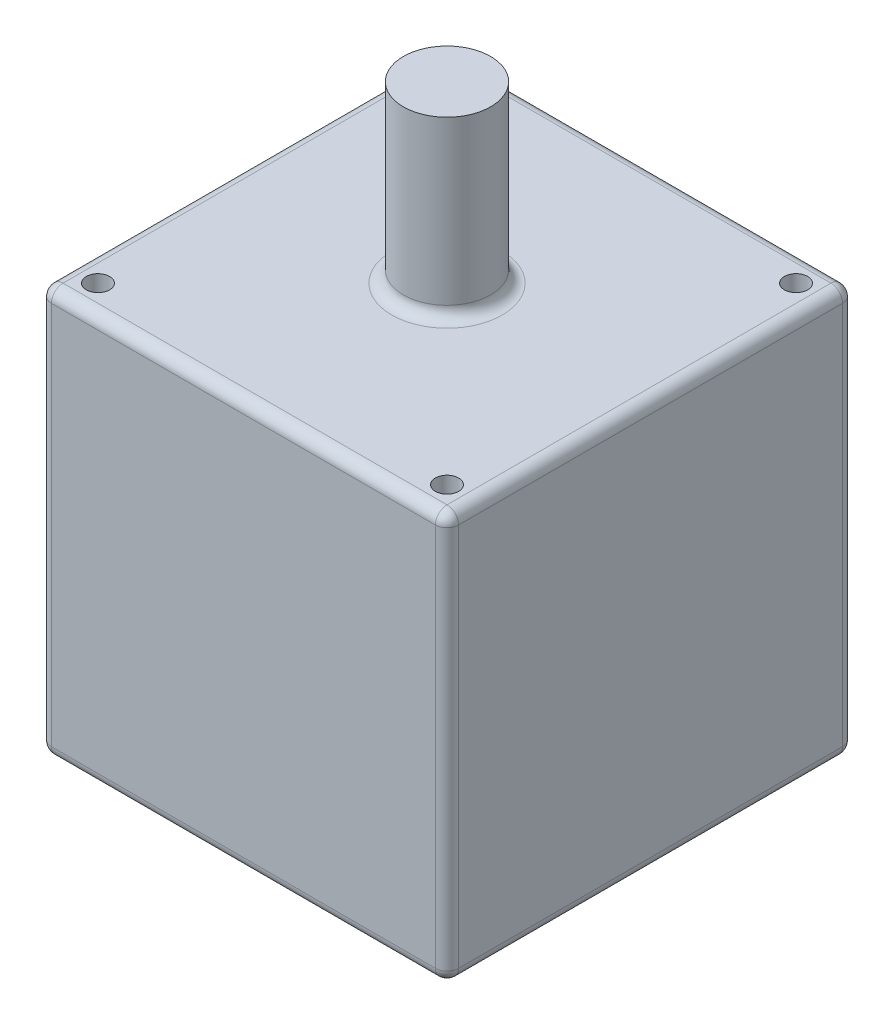
ISO-10303-21;
HEADER;
FILE_DESCRIPTION(('STEP AP214'),'2;1');
FILE_NAME('part.step','',(''),(''),'','','');
FILE_SCHEMA(('AUTOMOTIVE_DESIGN { 1 0 10303 214 1 1 1 1 }'));
ENDSEC;
DATA;
#1=APPLICATION_CONTEXT('core data for automotive mechanical design processes');
#2=APPLICATION_PROTOCOL_DEFINITION('international standard','automotive_design',2000,#1);
#3=PRODUCT_CONTEXT('',#1,'mechanical');
#4=PRODUCT('Part','Part','',(#3));
#5=PRODUCT_RELATED_PRODUCT_CATEGORY('part','',(#4));
#6=PRODUCT_DEFINITION_FORMATION('','',#4);
#7=PRODUCT_DEFINITION_CONTEXT('part definition',#1,'design');
#8=PRODUCT_DEFINITION('design','',#6,#7);
#9=PRODUCT_DEFINITION_SHAPE('','',#8);
#10=(LENGTH_UNIT() NAMED_UNIT(*) SI_UNIT(.MILLI.,.METRE.));
#11=(NAMED_UNIT(*) PLANE_ANGLE_UNIT() SI_UNIT($,.RADIAN.));
#12=(NAMED_UNIT(*) SI_UNIT($,.STERADIAN.) SOLID_ANGLE_UNIT());
#13=UNCERTAINTY_MEASURE_WITH_UNIT(LENGTH_MEASURE(1.E-05),#10,'distance_accuracy_value','');
#14=(GEOMETRIC_REPRESENTATION_CONTEXT(3) GLOBAL_UNCERTAINTY_ASSIGNED_CONTEXT((#13)) GLOBAL_UNIT_ASSIGNED_CONTEXT((#10,
#11,#12)) REPRESENTATION_CONTEXT('',''));
#15=CARTESIAN_POINT('',(0.,0.,0.));
#16=DIRECTION('',(0.,0.,1.));
#17=DIRECTION('',(1.,0.,0.));
#18=AXIS2_PLACEMENT_3D('',#15,#16,#17);
#19=CARTESIAN_POINT('',(17.5,35.,-17.5));
#20=DIRECTION('',(-1.,0.,0.));
#21=DIRECTION('',(0.,0.,1.));
#22=AXIS2_PLACEMENT_3D('',#19,#20,#21);
#23=PLANE('',#22);
#24=DIRECTION('',(0.,-1.,0.));
#25=VECTOR('',#24,1.);
#26=CARTESIAN_POINT('',(17.5,35.,-16.5));
#27=LINE('',#26,#25);
#28=CARTESIAN_POINT('',(17.5,1.,-16.5));
#29=VERTEX_POINT('',#28);
#30=CARTESIAN_POINT('',(17.5,34.,-16.5));
#31=VERTEX_POINT('',#30);
#32=EDGE_CURVE('E185',#29,#31,#27,.F.);
#33=ORIENTED_EDGE('',*,*,#32,.T.);
#34=DIRECTION('',(0.,0.,-1.));
#35=VECTOR('',#34,1.);
#36=CARTESIAN_POINT('',(17.5,34.,17.5));
#37=LINE('',#36,#35);
#38=CARTESIAN_POINT('',(17.5,34.,16.5));
#39=VERTEX_POINT('',#38);
#40=EDGE_CURVE('E188',#31,#39,#37,.F.);
#41=ORIENTED_EDGE('',*,*,#40,.T.);
#42=DIRECTION('',(0.,-1.,0.));
#43=VECTOR('',#42,1.);
#44=CARTESIAN_POINT('',(17.5,35.,16.5));
#45=LINE('',#44,#43);
#46=CARTESIAN_POINT('',(17.5,1.,16.5));
#47=VERTEX_POINT('',#46);
#48=EDGE_CURVE('E183',#39,#47,#45,.T.);
#49=ORIENTED_EDGE('',*,*,#48,.T.);
#50=DIRECTION('',(0.,0.,-1.));
#51=VECTOR('',#50,1.);
#52=CARTESIAN_POINT('',(17.5,1.,-17.5));
#53=LINE('',#52,#51);
#54=EDGE_CURVE('E181',#47,#29,#53,.T.);
#55=ORIENTED_EDGE('',*,*,#54,.T.);
#56=EDGE_LOOP('',(#33,#41,#49,#55));
#57=FACE_BOUND('',#56,.T.);
#58=ADVANCED_FACE('F36',(#57),#23,.F.);
#59=CARTESIAN_POINT('',(-17.5,35.,-17.5));
#60=DIRECTION('',(0.,0.,1.));
#61=DIRECTION('',(1.,0.,0.));
#62=AXIS2_PLACEMENT_3D('',#59,#60,#61);
#63=PLANE('',#62);
#64=DIRECTION('',(0.,-1.,0.));
#65=VECTOR('',#64,1.);
#66=CARTESIAN_POINT('',(-16.5,35.,-17.5));
#67=LINE('',#66,#65);
#68=CARTESIAN_POINT('',(-16.5,1.,-17.5));
#69=VERTEX_POINT('',#68);
#70=CARTESIAN_POINT('',(-16.5,34.,-17.5));
#71=VERTEX_POINT('',#70);
#72=EDGE_CURVE('E174',#69,#71,#67,.F.);
#73=ORIENTED_EDGE('',*,*,#72,.T.);
#74=DIRECTION('',(-1.,0.,0.));
#75=VECTOR('',#74,1.);
#76=CARTESIAN_POINT('',(17.5,34.,-17.5));
#77=LINE('',#76,#75);
#78=CARTESIAN_POINT('',(16.5,34.,-17.5));
#79=VERTEX_POINT('',#78);
#80=EDGE_CURVE('E179',#71,#79,#77,.F.);
#81=ORIENTED_EDGE('',*,*,#80,.T.);
#82=DIRECTION('',(0.,-1.,0.));
#83=VECTOR('',#82,1.);
#84=CARTESIAN_POINT('',(16.5,35.,-17.5));
#85=LINE('',#84,#83);
#86=CARTESIAN_POINT('',(16.5,1.,-17.5));
#87=VERTEX_POINT('',#86);
#88=EDGE_CURVE('E176',#79,#87,#85,.T.);
#89=ORIENTED_EDGE('',*,*,#88,.T.);
#90=DIRECTION('',(-1.,0.,0.));
#91=VECTOR('',#90,1.);
#92=CARTESIAN_POINT('',(-17.5,1.,-17.5));
#93=LINE('',#92,#91);
#94=EDGE_CURVE('E172',#87,#69,#93,.T.);
#95=ORIENTED_EDGE('',*,*,#94,.T.);
#96=EDGE_LOOP('',(#73,#81,#89,#95));
#97=FACE_BOUND('',#96,.T.);
#98=ADVANCED_FACE('F378',(#97),#63,.F.);
#99=CARTESIAN_POINT('',(-17.5,35.,-17.5));
#100=DIRECTION('',(1.,0.,0.));
#101=DIRECTION('',(0.,0.,-1.));
#102=AXIS2_PLACEMENT_3D('',#99,#100,#101);
#103=PLANE('',#102);
#104=DIRECTION('',(0.,-1.,0.));
#105=VECTOR('',#104,1.);
#106=CARTESIAN_POINT('',(-17.5,35.,16.5));
#107=LINE('',#106,#105);
#108=CARTESIAN_POINT('',(-17.5,1.,16.5));
#109=VERTEX_POINT('',#108);
#110=CARTESIAN_POINT('',(-17.5,34.,16.5));
#111=VERTEX_POINT('',#110);
#112=EDGE_CURVE('E192',#109,#111,#107,.F.);
#113=ORIENTED_EDGE('',*,*,#112,.T.);
#114=DIRECTION('',(0.,0.,1.));
#115=VECTOR('',#114,1.);
#116=CARTESIAN_POINT('',(-17.5,34.,-17.5));
#117=LINE('',#116,#115);
#118=CARTESIAN_POINT('',(-17.5,34.,-16.5));
#119=VERTEX_POINT('',#118);
#120=EDGE_CURVE('E197',#111,#119,#117,.F.);
#121=ORIENTED_EDGE('',*,*,#120,.T.);
#122=DIRECTION('',(0.,-1.,0.));
#123=VECTOR('',#122,1.);
#124=CARTESIAN_POINT('',(-17.5,35.,-16.5));
#125=LINE('',#124,#123);
#126=CARTESIAN_POINT('',(-17.5,1.,-16.5));
#127=VERTEX_POINT('',#126);
#128=EDGE_CURVE('E194',#119,#127,#125,.T.);
#129=ORIENTED_EDGE('',*,*,#128,.T.);
#130=DIRECTION('',(0.,0.,1.));
#131=VECTOR('',#130,1.);
#132=CARTESIAN_POINT('',(-17.5,1.,-17.5));
#133=LINE('',#132,#131);
#134=EDGE_CURVE('E190',#127,#109,#133,.T.);
#135=ORIENTED_EDGE('',*,*,#134,.T.);
#136=EDGE_LOOP('',(#113,#121,#129,#135));
#137=FACE_BOUND('',#136,.T.);
#138=ADVANCED_FACE('F318',(#137),#103,.F.);
#139=CARTESIAN_POINT('',(-17.5,35.,17.5));
#140=DIRECTION('',(0.,0.,-1.));
#141=DIRECTION('',(-1.,0.,0.));
#142=AXIS2_PLACEMENT_3D('',#139,#140,#141);
#143=PLANE('',#142);
#144=DIRECTION('',(0.,-1.,0.));
#145=VECTOR('',#144,1.);
#146=CARTESIAN_POINT('',(16.5,35.,17.5));
#147=LINE('',#146,#145);
#148=CARTESIAN_POINT('',(16.5,1.,17.5));
#149=VERTEX_POINT('',#148);
#150=CARTESIAN_POINT('',(16.5,34.,17.5));
#151=VERTEX_POINT('',#150);
#152=EDGE_CURVE('E201',#149,#151,#147,.F.);
#153=ORIENTED_EDGE('',*,*,#152,.T.);
#154=DIRECTION('',(1.,0.,0.));
#155=VECTOR('',#154,1.);
#156=CARTESIAN_POINT('',(-17.5,34.,17.5));
#157=LINE('',#156,#155);
#158=CARTESIAN_POINT('',(-16.5,34.,17.5));
#159=VERTEX_POINT('',#158);
#160=EDGE_CURVE('E206',#151,#159,#157,.F.);
#161=ORIENTED_EDGE('',*,*,#160,.T.);
#162=DIRECTION('',(0.,-1.,0.));
#163=VECTOR('',#162,1.);
#164=CARTESIAN_POINT('',(-16.5,35.,17.5));
#165=LINE('',#164,#163);
#166=CARTESIAN_POINT('',(-16.5,1.,17.5));
#167=VERTEX_POINT('',#166);
#168=EDGE_CURVE('E203',#159,#167,#165,.T.);
#169=ORIENTED_EDGE('',*,*,#168,.T.);
#170=DIRECTION('',(1.,0.,0.));
#171=VECTOR('',#170,1.);
#172=CARTESIAN_POINT('',(-17.5,1.,17.5));
#173=LINE('',#172,#171);
#174=EDGE_CURVE('E199',#167,#149,#173,.T.);
#175=ORIENTED_EDGE('',*,*,#174,.T.);
#176=EDGE_LOOP('',(#153,#161,#169,#175));
#177=FACE_BOUND('',#176,.T.);
#178=ADVANCED_FACE('F332',(#177),#143,.F.);
#179=CARTESIAN_POINT('',(0.,35.,0.));
#180=DIRECTION('',(0.,1.,0.));
#181=DIRECTION('',(0.,0.,1.));
#182=AXIS2_PLACEMENT_3D('',#179,#180,#181);
#183=PLANE('',#182);
#184=CARTESIAN_POINT('',(-15.,35.,-15.));
#185=DIRECTION('',(0.,1.,0.));
#186=DIRECTION('',(0.,0.,1.));
#187=AXIS2_PLACEMENT_3D('',#184,#185,#186);
#188=CIRCLE('',#187,0.999999999999989);
#189=CARTESIAN_POINT('',(-15.,35.,-14.));
#190=VERTEX_POINT('',#189);
#191=EDGE_CURVE('E146',#190,#190,#188,.T.);
#192=ORIENTED_EDGE('',*,*,#191,.F.);
#193=EDGE_LOOP('',(#192));
#194=FACE_BOUND('',#193,.T.);
#195=CARTESIAN_POINT('',(15.,35.,-15.));
#196=DIRECTION('',(0.,1.,0.));
#197=DIRECTION('',(0.,0.,1.));
#198=AXIS2_PLACEMENT_3D('',#195,#196,#197);
#199=CIRCLE('',#198,0.999999999999989);
#200=CARTESIAN_POINT('',(15.,35.,-14.));
#201=VERTEX_POINT('',#200);
#202=EDGE_CURVE('E145',#201,#201,#199,.T.);
#203=ORIENTED_EDGE('',*,*,#202,.F.);
#204=EDGE_LOOP('',(#203));
#205=FACE_BOUND('',#204,.T.);
#206=CARTESIAN_POINT('',(15.,35.,15.));
#207=DIRECTION('',(0.,1.,0.));
#208=DIRECTION('',(0.,0.,1.));
#209=AXIS2_PLACEMENT_3D('',#206,#207,#208);
#210=CIRCLE('',#209,0.999999999999989);
#211=CARTESIAN_POINT('',(15.,35.,16.));
#212=VERTEX_POINT('',#211);
#213=EDGE_CURVE('E156',#212,#212,#210,.T.);
#214=ORIENTED_EDGE('',*,*,#213,.F.);
#215=EDGE_LOOP('',(#214));
#216=FACE_BOUND('',#215,.T.);
#217=CARTESIAN_POINT('',(-15.,35.,15.));
#218=DIRECTION('',(0.,1.,0.));
#219=DIRECTION('',(0.,0.,1.));
#220=AXIS2_PLACEMENT_3D('',#217,#218,#219);
#221=CIRCLE('',#220,0.999999999999989);
#222=CARTESIAN_POINT('',(-15.,35.,16.));
#223=VERTEX_POINT('',#222);
#224=EDGE_CURVE('E162',#223,#223,#221,.T.);
#225=ORIENTED_EDGE('',*,*,#224,.F.);
#226=EDGE_LOOP('',(#225));
#227=FACE_BOUND('',#226,.T.);
#228=DIRECTION('',(0.,0.,1.));
#229=VECTOR('',#228,1.);
#230=CARTESIAN_POINT('',(-16.5,35.,17.5));
#231=LINE('',#230,#229);
#232=CARTESIAN_POINT('',(-16.5,35.,-16.5));
#233=VERTEX_POINT('',#232);
#234=CARTESIAN_POINT('',(-16.5,35.,16.5));
#235=VERTEX_POINT('',#234);
#236=EDGE_CURVE('E215',#233,#235,#231,.T.);
#237=ORIENTED_EDGE('',*,*,#236,.T.);
#238=DIRECTION('',(1.,0.,0.));
#239=VECTOR('',#238,1.);
#240=CARTESIAN_POINT('',(17.5,35.,16.5));
#241=LINE('',#240,#239);
#242=CARTESIAN_POINT('',(16.5,35.,16.5));
#243=VERTEX_POINT('',#242);
#244=EDGE_CURVE('E217',#235,#243,#241,.T.);
#245=ORIENTED_EDGE('',*,*,#244,.T.);
#246=DIRECTION('',(0.,0.,-1.));
#247=VECTOR('',#246,1.);
#248=CARTESIAN_POINT('',(16.5,35.,-17.5));
#249=LINE('',#248,#247);
#250=CARTESIAN_POINT('',(16.5,35.,-16.5));
#251=VERTEX_POINT('',#250);
#252=EDGE_CURVE('E211',#243,#251,#249,.T.);
#253=ORIENTED_EDGE('',*,*,#252,.T.);
#254=DIRECTION('',(-1.,0.,0.));
#255=VECTOR('',#254,1.);
#256=CARTESIAN_POINT('',(-17.5,35.,-16.5));
#257=LINE('',#256,#255);
#258=EDGE_CURVE('E213',#251,#233,#257,.T.);
#259=ORIENTED_EDGE('',*,*,#258,.T.);
#260=EDGE_LOOP('',(#237,#245,#253,#259));
#261=FACE_BOUND('',#260,.T.);
#262=CARTESIAN_POINT('',(0.,35.,0.));
#263=DIRECTION('',(0.,1.,0.));
#264=DIRECTION('',(0.,0.,1.));
#265=AXIS2_PLACEMENT_3D('',#262,#263,#264);
#266=CIRCLE('',#265,4.75);
#267=CARTESIAN_POINT('',(0.,35.,4.75));
#268=VERTEX_POINT('',#267);
#269=EDGE_CURVE('E208',#268,#268,#266,.F.);
#270=ORIENTED_EDGE('',*,*,#269,.T.);
#271=EDGE_LOOP('',(#270));
#272=FACE_BOUND('',#271,.T.);
#273=ADVANCED_FACE('F309',(#194,#205,#216,#227,#261,#272),#183,.T.);
#274=CARTESIAN_POINT('',(0.,0.,0.));
#275=DIRECTION('',(0.,1.,0.));
#276=DIRECTION('',(0.,0.,1.));
#277=AXIS2_PLACEMENT_3D('',#274,#275,#276);
#278=PLANE('',#277);
#279=DIRECTION('',(0.,0.,1.));
#280=VECTOR('',#279,1.);
#281=CARTESIAN_POINT('',(-16.5,0.,0.));
#282=LINE('',#281,#280);
#283=CARTESIAN_POINT('',(-16.5,0.,16.5));
#284=VERTEX_POINT('',#283);
#285=CARTESIAN_POINT('',(-16.5,0.,-16.5));
#286=VERTEX_POINT('',#285);
#287=EDGE_CURVE('E45',#284,#286,#282,.F.);
#288=ORIENTED_EDGE('',*,*,#287,.T.);
#289=DIRECTION('',(-1.,0.,0.));
#290=VECTOR('',#289,1.);
#291=CARTESIAN_POINT('',(0.,0.,-16.5));
#292=LINE('',#291,#290);
#293=CARTESIAN_POINT('',(16.5,0.,-16.5));
#294=VERTEX_POINT('',#293);
#295=EDGE_CURVE('E11',#286,#294,#292,.F.);
#296=ORIENTED_EDGE('',*,*,#295,.T.);
#297=DIRECTION('',(0.,0.,-1.));
#298=VECTOR('',#297,1.);
#299=CARTESIAN_POINT('',(16.5,0.,0.));
#300=LINE('',#299,#298);
#301=CARTESIAN_POINT('',(16.5,0.,16.5));
#302=VERTEX_POINT('',#301);
#303=EDGE_CURVE('E223',#294,#302,#300,.F.);
#304=ORIENTED_EDGE('',*,*,#303,.T.);
#305=DIRECTION('',(1.,0.,0.));
#306=VECTOR('',#305,1.);
#307=CARTESIAN_POINT('',(0.,0.,16.5));
#308=LINE('',#307,#306);
#309=EDGE_CURVE('E56',#302,#284,#308,.F.);
#310=ORIENTED_EDGE('',*,*,#309,.T.);
#311=EDGE_LOOP('',(#288,#296,#304,#310));
#312=FACE_BOUND('',#311,.T.);
#313=ADVANCED_FACE('F632',(#312),#278,.F.);
#314=CARTESIAN_POINT('',(0.,50.,0.));
#315=DIRECTION('',(0.,-1.,0.));
#316=DIRECTION('',(0.,0.,-1.));
#317=AXIS2_PLACEMENT_3D('',#314,#315,#316);
#318=CYLINDRICAL_SURFACE('',#317,3.75);
#319=CARTESIAN_POINT('',(0.,36.,0.));
#320=DIRECTION('',(0.,1.,0.));
#321=DIRECTION('',(0.,0.,1.));
#322=AXIS2_PLACEMENT_3D('',#319,#320,#321);
#323=CIRCLE('',#322,3.75);
#324=CARTESIAN_POINT('',(0.,36.,3.75));
#325=VERTEX_POINT('',#324);
#326=EDGE_CURVE('E220',#325,#325,#323,.T.);
#327=ORIENTED_EDGE('',*,*,#326,.T.);
#328=EDGE_LOOP('',(#327));
#329=FACE_BOUND('',#328,.T.);
#330=CARTESIAN_POINT('',(0.,50.,0.));
#331=DIRECTION('',(0.,1.,0.));
#332=DIRECTION('',(0.,0.,1.));
#333=AXIS2_PLACEMENT_3D('',#330,#331,#332);
#334=CIRCLE('',#333,3.75);
#335=CARTESIAN_POINT('',(0.,50.,3.75));
#336=VERTEX_POINT('',#335);
#337=EDGE_CURVE('E169',#336,#336,#334,.T.);
#338=ORIENTED_EDGE('',*,*,#337,.F.);
#339=EDGE_LOOP('',(#338));
#340=FACE_BOUND('',#339,.T.);
#341=ADVANCED_FACE('F624',(#329,#340),#318,.T.);
#342=CARTESIAN_POINT('',(0.,50.,0.));
#343=DIRECTION('',(0.,1.,0.));
#344=DIRECTION('',(0.,0.,1.));
#345=AXIS2_PLACEMENT_3D('',#342,#343,#344);
#346=PLANE('',#345);
#347=ORIENTED_EDGE('',*,*,#337,.T.);
#348=EDGE_LOOP('',(#347));
#349=FACE_BOUND('',#348,.T.);
#350=ADVANCED_FACE('F616',(#349),#346,.T.);
#351=CARTESIAN_POINT('',(-16.5,35.,16.5));
#352=DIRECTION('',(0.,-1.,0.));
#353=DIRECTION('',(0.,0.,-1.));
#354=AXIS2_PLACEMENT_3D('',#351,#352,#353);
#355=CYLINDRICAL_SURFACE('',#354,1.);
#356=CARTESIAN_POINT('',(-16.5,34.,16.5));
#357=DIRECTION('',(0.,1.,0.));
#358=DIRECTION('',(0.,0.,1.));
#359=AXIS2_PLACEMENT_3D('',#356,#357,#358);
#360=CIRCLE('',#359,1.);
#361=EDGE_CURVE('E40',#111,#159,#360,.T.);
#362=ORIENTED_EDGE('',*,*,#361,.F.);
#363=ORIENTED_EDGE('',*,*,#112,.F.);
#364=CARTESIAN_POINT('',(-16.5,1.,16.5));
#365=DIRECTION('',(0.,-1.,0.));
#366=DIRECTION('',(0.,0.,-1.));
#367=AXIS2_PLACEMENT_3D('',#364,#365,#366);
#368=CIRCLE('',#367,1.);
#369=EDGE_CURVE('E286',#167,#109,#368,.T.);
#370=ORIENTED_EDGE('',*,*,#369,.F.);
#371=ORIENTED_EDGE('',*,*,#168,.F.);
#372=EDGE_LOOP('',(#362,#363,#370,#371));
#373=FACE_BOUND('',#372,.T.);
#374=ADVANCED_FACE('F330',(#373),#355,.T.);
#375=CARTESIAN_POINT('',(-16.5,34.,16.5));
#376=DIRECTION('',(0.,0.,1.));
#377=DIRECTION('',(1.,0.,0.));
#378=AXIS2_PLACEMENT_3D('',#375,#376,#377);
#379=SPHERICAL_SURFACE('',#378,1.);
#380=CARTESIAN_POINT('',(-16.5,34.,16.5));
#381=DIRECTION('',(0.,0.,1.));
#382=DIRECTION('',(1.,0.,0.));
#383=AXIS2_PLACEMENT_3D('',#380,#381,#382);
#384=CIRCLE('',#383,1.);
#385=EDGE_CURVE('E281',#111,#235,#384,.F.);
#386=ORIENTED_EDGE('',*,*,#385,.F.);
#387=ORIENTED_EDGE('',*,*,#361,.T.);
#388=CARTESIAN_POINT('',(-16.5,34.,16.5));
#389=DIRECTION('',(-1.,0.,0.));
#390=DIRECTION('',(0.,0.,1.));
#391=AXIS2_PLACEMENT_3D('',#388,#389,#390);
#392=CIRCLE('',#391,1.);
#393=EDGE_CURVE('E284',#235,#159,#392,.F.);
#394=ORIENTED_EDGE('',*,*,#393,.F.);
#395=EDGE_LOOP('',(#386,#387,#394));
#396=FACE_BOUND('',#395,.T.);
#397=ADVANCED_FACE('F297',(#396),#379,.T.);
#398=CARTESIAN_POINT('',(-16.5,1.,16.5));
#399=DIRECTION('',(0.,0.,1.));
#400=DIRECTION('',(1.,0.,0.));
#401=AXIS2_PLACEMENT_3D('',#398,#399,#400);
#402=SPHERICAL_SURFACE('',#401,1.);
#403=CARTESIAN_POINT('',(-16.5,1.,16.5));
#404=DIRECTION('',(-1.,0.,0.));
#405=DIRECTION('',(0.,0.,1.));
#406=AXIS2_PLACEMENT_3D('',#403,#404,#405);
#407=CIRCLE('',#406,1.);
#408=EDGE_CURVE('E276',#167,#284,#407,.F.);
#409=ORIENTED_EDGE('',*,*,#408,.F.);
#410=ORIENTED_EDGE('',*,*,#369,.T.);
#411=CARTESIAN_POINT('',(-16.5,1.,16.5));
#412=DIRECTION('',(0.,0.,1.));
#413=DIRECTION('',(1.,0.,0.));
#414=AXIS2_PLACEMENT_3D('',#411,#412,#413);
#415=CIRCLE('',#414,1.);
#416=EDGE_CURVE('E278',#284,#109,#415,.F.);
#417=ORIENTED_EDGE('',*,*,#416,.F.);
#418=EDGE_LOOP('',(#409,#410,#417));
#419=FACE_BOUND('',#418,.T.);
#420=ADVANCED_FACE('F594',(#419),#402,.T.);
#421=CARTESIAN_POINT('',(0.,34.,16.5));
#422=DIRECTION('',(-1.,0.,0.));
#423=DIRECTION('',(0.,0.,1.));
#424=AXIS2_PLACEMENT_3D('',#421,#422,#423);
#425=CYLINDRICAL_SURFACE('',#424,1.);
#426=ORIENTED_EDGE('',*,*,#393,.T.);
#427=ORIENTED_EDGE('',*,*,#160,.F.);
#428=CARTESIAN_POINT('',(16.5,34.,16.5));
#429=DIRECTION('',(1.,0.,0.));
#430=DIRECTION('',(0.,0.,-1.));
#431=AXIS2_PLACEMENT_3D('',#428,#429,#430);
#432=CIRCLE('',#431,1.);
#433=EDGE_CURVE('E270',#243,#151,#432,.T.);
#434=ORIENTED_EDGE('',*,*,#433,.F.);
#435=ORIENTED_EDGE('',*,*,#244,.F.);
#436=EDGE_LOOP('',(#426,#427,#434,#435));
#437=FACE_BOUND('',#436,.T.);
#438=ADVANCED_FACE('F305',(#437),#425,.T.);
#439=CARTESIAN_POINT('',(-16.5,34.,0.));
#440=DIRECTION('',(0.,0.,-1.));
#441=DIRECTION('',(-1.,0.,0.));
#442=AXIS2_PLACEMENT_3D('',#439,#440,#441);
#443=CYLINDRICAL_SURFACE('',#442,1.);
#444=ORIENTED_EDGE('',*,*,#385,.T.);
#445=ORIENTED_EDGE('',*,*,#236,.F.);
#446=CARTESIAN_POINT('',(-16.5,34.,-16.5));
#447=DIRECTION('',(0.,0.,-1.));
#448=DIRECTION('',(-1.,0.,0.));
#449=AXIS2_PLACEMENT_3D('',#446,#447,#448);
#450=CIRCLE('',#449,1.);
#451=EDGE_CURVE('E267',#119,#233,#450,.T.);
#452=ORIENTED_EDGE('',*,*,#451,.F.);
#453=ORIENTED_EDGE('',*,*,#120,.F.);
#454=EDGE_LOOP('',(#444,#445,#452,#453));
#455=FACE_BOUND('',#454,.T.);
#456=ADVANCED_FACE('F315',(#455),#443,.T.);
#457=CARTESIAN_POINT('',(-16.5,35.,-16.5));
#458=DIRECTION('',(0.,-1.,0.));
#459=DIRECTION('',(0.,0.,-1.));
#460=AXIS2_PLACEMENT_3D('',#457,#458,#459);
#461=CYLINDRICAL_SURFACE('',#460,1.);
#462=CARTESIAN_POINT('',(-16.5,1.,-16.5));
#463=DIRECTION('',(0.,-1.,0.));
#464=DIRECTION('',(0.,0.,-1.));
#465=AXIS2_PLACEMENT_3D('',#462,#463,#464);
#466=CIRCLE('',#465,1.);
#467=EDGE_CURVE('E261',#127,#69,#466,.T.);
#468=ORIENTED_EDGE('',*,*,#467,.F.);
#469=ORIENTED_EDGE('',*,*,#128,.F.);
#470=CARTESIAN_POINT('',(-16.5,34.,-16.5));
#471=DIRECTION('',(0.,1.,0.));
#472=DIRECTION('',(0.,0.,1.));
#473=AXIS2_PLACEMENT_3D('',#470,#471,#472);
#474=CIRCLE('',#473,1.);
#475=EDGE_CURVE('E264',#71,#119,#474,.T.);
#476=ORIENTED_EDGE('',*,*,#475,.F.);
#477=ORIENTED_EDGE('',*,*,#72,.F.);
#478=EDGE_LOOP('',(#468,#469,#476,#477));
#479=FACE_BOUND('',#478,.T.);
#480=ADVANCED_FACE('F322',(#479),#461,.T.);
#481=CARTESIAN_POINT('',(-16.5,1.,-17.5));
#482=DIRECTION('',(0.,0.,1.));
#483=DIRECTION('',(1.,0.,0.));
#484=AXIS2_PLACEMENT_3D('',#481,#482,#483);
#485=CYLINDRICAL_SURFACE('',#484,1.);
#486=ORIENTED_EDGE('',*,*,#416,.T.);
#487=ORIENTED_EDGE('',*,*,#134,.F.);
#488=CARTESIAN_POINT('',(-16.5,1.,-16.5));
#489=DIRECTION('',(0.,0.,-1.));
#490=DIRECTION('',(-1.,0.,0.));
#491=AXIS2_PLACEMENT_3D('',#488,#489,#490);
#492=CIRCLE('',#491,1.);
#493=EDGE_CURVE('E259',#286,#127,#492,.T.);
#494=ORIENTED_EDGE('',*,*,#493,.F.);
#495=ORIENTED_EDGE('',*,*,#287,.F.);
#496=EDGE_LOOP('',(#486,#487,#494,#495));
#497=FACE_BOUND('',#496,.T.);
#498=ADVANCED_FACE('F329',(#497),#485,.T.);
#499=CARTESIAN_POINT('',(-17.5,1.,16.5));
#500=DIRECTION('',(1.,0.,0.));
#501=DIRECTION('',(0.,0.,-1.));
#502=AXIS2_PLACEMENT_3D('',#499,#500,#501);
#503=CYLINDRICAL_SURFACE('',#502,1.);
#504=ORIENTED_EDGE('',*,*,#408,.T.);
#505=ORIENTED_EDGE('',*,*,#309,.F.);
#506=CARTESIAN_POINT('',(16.5,1.,16.5));
#507=DIRECTION('',(1.,0.,0.));
#508=DIRECTION('',(0.,0.,-1.));
#509=AXIS2_PLACEMENT_3D('',#506,#507,#508);
#510=CIRCLE('',#509,1.);
#511=EDGE_CURVE('E256',#149,#302,#510,.T.);
#512=ORIENTED_EDGE('',*,*,#511,.F.);
#513=ORIENTED_EDGE('',*,*,#174,.F.);
#514=EDGE_LOOP('',(#504,#505,#512,#513));
#515=FACE_BOUND('',#514,.T.);
#516=ADVANCED_FACE('F341',(#515),#503,.T.);
#517=CARTESIAN_POINT('',(16.5,35.,16.5));
#518=DIRECTION('',(0.,-1.,0.));
#519=DIRECTION('',(0.,0.,-1.));
#520=AXIS2_PLACEMENT_3D('',#517,#518,#519);
#521=CYLINDRICAL_SURFACE('',#520,1.);
#522=CARTESIAN_POINT('',(16.5,34.,16.5));
#523=DIRECTION('',(0.,1.,0.));
#524=DIRECTION('',(0.,0.,1.));
#525=AXIS2_PLACEMENT_3D('',#522,#523,#524);
#526=CIRCLE('',#525,1.);
#527=EDGE_CURVE('E273',#151,#39,#526,.T.);
#528=ORIENTED_EDGE('',*,*,#527,.F.);
#529=ORIENTED_EDGE('',*,*,#152,.F.);
#530=CARTESIAN_POINT('',(16.5,1.,16.5));
#531=DIRECTION('',(0.,-1.,0.));
#532=DIRECTION('',(0.,0.,-1.));
#533=AXIS2_PLACEMENT_3D('',#530,#531,#532);
#534=CIRCLE('',#533,1.);
#535=EDGE_CURVE('E253',#47,#149,#534,.T.);
#536=ORIENTED_EDGE('',*,*,#535,.F.);
#537=ORIENTED_EDGE('',*,*,#48,.F.);
#538=EDGE_LOOP('',(#528,#529,#536,#537));
#539=FACE_BOUND('',#538,.T.);
#540=ADVANCED_FACE('F337',(#539),#521,.T.);
#541=CARTESIAN_POINT('',(16.5,34.,16.5));
#542=DIRECTION('',(0.,0.,1.));
#543=DIRECTION('',(1.,0.,0.));
#544=AXIS2_PLACEMENT_3D('',#541,#542,#543);
#545=SPHERICAL_SURFACE('',#544,1.);
#546=ORIENTED_EDGE('',*,*,#433,.T.);
#547=ORIENTED_EDGE('',*,*,#527,.T.);
#548=CARTESIAN_POINT('',(16.5,34.,16.5));
#549=DIRECTION('',(0.,0.,1.));
#550=DIRECTION('',(1.,0.,0.));
#551=AXIS2_PLACEMENT_3D('',#548,#549,#550);
#552=CIRCLE('',#551,1.);
#553=EDGE_CURVE('E250',#243,#39,#552,.F.);
#554=ORIENTED_EDGE('',*,*,#553,.F.);
#555=EDGE_LOOP('',(#546,#547,#554));
#556=FACE_BOUND('',#555,.T.);
#557=ADVANCED_FACE('F354',(#556),#545,.T.);
#558=CARTESIAN_POINT('',(-16.5,34.,-16.5));
#559=DIRECTION('',(0.,0.,1.));
#560=DIRECTION('',(1.,0.,0.));
#561=AXIS2_PLACEMENT_3D('',#558,#559,#560);
#562=SPHERICAL_SURFACE('',#561,1.);
#563=ORIENTED_EDGE('',*,*,#475,.T.);
#564=ORIENTED_EDGE('',*,*,#451,.T.);
#565=CARTESIAN_POINT('',(-16.5,34.,-16.5));
#566=DIRECTION('',(-1.,0.,0.));
#567=DIRECTION('',(0.,0.,1.));
#568=AXIS2_PLACEMENT_3D('',#565,#566,#567);
#569=CIRCLE('',#568,1.);
#570=EDGE_CURVE('E247',#71,#233,#569,.F.);
#571=ORIENTED_EDGE('',*,*,#570,.F.);
#572=EDGE_LOOP('',(#563,#564,#571));
#573=FACE_BOUND('',#572,.T.);
#574=ADVANCED_FACE('F367',(#573),#562,.T.);
#575=CARTESIAN_POINT('',(-16.5,1.,-16.5));
#576=DIRECTION('',(0.,0.,1.));
#577=DIRECTION('',(1.,0.,0.));
#578=AXIS2_PLACEMENT_3D('',#575,#576,#577);
#579=SPHERICAL_SURFACE('',#578,1.);
#580=ORIENTED_EDGE('',*,*,#493,.T.);
#581=ORIENTED_EDGE('',*,*,#467,.T.);
#582=CARTESIAN_POINT('',(-16.5,1.,-16.5));
#583=DIRECTION('',(-1.,0.,0.));
#584=DIRECTION('',(0.,0.,1.));
#585=AXIS2_PLACEMENT_3D('',#582,#583,#584);
#586=CIRCLE('',#585,1.);
#587=EDGE_CURVE('E244',#286,#69,#586,.F.);
#588=ORIENTED_EDGE('',*,*,#587,.F.);
#589=EDGE_LOOP('',(#580,#581,#588));
#590=FACE_BOUND('',#589,.T.);
#591=ADVANCED_FACE('F369',(#590),#579,.T.);
#592=CARTESIAN_POINT('',(16.5,1.,16.5));
#593=DIRECTION('',(0.,0.,1.));
#594=DIRECTION('',(1.,0.,0.));
#595=AXIS2_PLACEMENT_3D('',#592,#593,#594);
#596=SPHERICAL_SURFACE('',#595,1.);
#597=ORIENTED_EDGE('',*,*,#535,.T.);
#598=ORIENTED_EDGE('',*,*,#511,.T.);
#599=CARTESIAN_POINT('',(16.5,1.,16.5));
#600=DIRECTION('',(0.,0.,1.));
#601=DIRECTION('',(1.,0.,0.));
#602=AXIS2_PLACEMENT_3D('',#599,#600,#601);
#603=CIRCLE('',#602,1.);
#604=EDGE_CURVE('E241',#47,#302,#603,.F.);
#605=ORIENTED_EDGE('',*,*,#604,.F.);
#606=EDGE_LOOP('',(#597,#598,#605));
#607=FACE_BOUND('',#606,.T.);
#608=ADVANCED_FACE('F343',(#607),#596,.T.);
#609=CARTESIAN_POINT('',(16.5,34.,0.));
#610=DIRECTION('',(0.,0.,1.));
#611=DIRECTION('',(1.,0.,0.));
#612=AXIS2_PLACEMENT_3D('',#609,#610,#611);
#613=CYLINDRICAL_SURFACE('',#612,1.);
#614=ORIENTED_EDGE('',*,*,#553,.T.);
#615=ORIENTED_EDGE('',*,*,#40,.F.);
#616=CARTESIAN_POINT('',(16.5,34.,-16.5));
#617=DIRECTION('',(0.,0.,-1.));
#618=DIRECTION('',(-1.,0.,0.));
#619=AXIS2_PLACEMENT_3D('',#616,#617,#618);
#620=CIRCLE('',#619,1.);
#621=EDGE_CURVE('E238',#251,#31,#620,.T.);
#622=ORIENTED_EDGE('',*,*,#621,.F.);
#623=ORIENTED_EDGE('',*,*,#252,.F.);
#624=EDGE_LOOP('',(#614,#615,#622,#623));
#625=FACE_BOUND('',#624,.T.);
#626=ADVANCED_FACE('F356',(#625),#613,.T.);
#627=CARTESIAN_POINT('',(0.,34.,-16.5));
#628=DIRECTION('',(1.,0.,0.));
#629=DIRECTION('',(0.,0.,-1.));
#630=AXIS2_PLACEMENT_3D('',#627,#628,#629);
#631=CYLINDRICAL_SURFACE('',#630,1.);
#632=ORIENTED_EDGE('',*,*,#570,.T.);
#633=ORIENTED_EDGE('',*,*,#258,.F.);
#634=CARTESIAN_POINT('',(16.5,34.,-16.5));
#635=DIRECTION('',(1.,0.,0.));
#636=DIRECTION('',(0.,0.,-1.));
#637=AXIS2_PLACEMENT_3D('',#634,#635,#636);
#638=CIRCLE('',#637,1.);
#639=EDGE_CURVE('E235',#79,#251,#638,.T.);
#640=ORIENTED_EDGE('',*,*,#639,.F.);
#641=ORIENTED_EDGE('',*,*,#80,.F.);
#642=EDGE_LOOP('',(#632,#633,#640,#641));
#643=FACE_BOUND('',#642,.T.);
#644=ADVANCED_FACE('F365',(#643),#631,.T.);
#645=CARTESIAN_POINT('',(-17.5,1.,-16.5));
#646=DIRECTION('',(-1.,0.,0.));
#647=DIRECTION('',(0.,0.,1.));
#648=AXIS2_PLACEMENT_3D('',#645,#646,#647);
#649=CYLINDRICAL_SURFACE('',#648,1.);
#650=ORIENTED_EDGE('',*,*,#587,.T.);
#651=ORIENTED_EDGE('',*,*,#94,.F.);
#652=CARTESIAN_POINT('',(16.5,1.,-16.5));
#653=DIRECTION('',(1.,0.,0.));
#654=DIRECTION('',(0.,0.,-1.));
#655=AXIS2_PLACEMENT_3D('',#652,#653,#654);
#656=CIRCLE('',#655,1.);
#657=EDGE_CURVE('E232',#294,#87,#656,.T.);
#658=ORIENTED_EDGE('',*,*,#657,.F.);
#659=ORIENTED_EDGE('',*,*,#295,.F.);
#660=EDGE_LOOP('',(#650,#651,#658,#659));
#661=FACE_BOUND('',#660,.T.);
#662=ADVANCED_FACE('F399',(#661),#649,.T.);
#663=CARTESIAN_POINT('',(16.5,1.,-17.5));
#664=DIRECTION('',(0.,0.,-1.));
#665=DIRECTION('',(-1.,0.,0.));
#666=AXIS2_PLACEMENT_3D('',#663,#664,#665);
#667=CYLINDRICAL_SURFACE('',#666,1.);
#668=ORIENTED_EDGE('',*,*,#604,.T.);
#669=ORIENTED_EDGE('',*,*,#303,.F.);
#670=CARTESIAN_POINT('',(16.5,1.,-16.5));
#671=DIRECTION('',(0.,0.,-1.));
#672=DIRECTION('',(-1.,0.,0.));
#673=AXIS2_PLACEMENT_3D('',#670,#671,#672);
#674=CIRCLE('',#673,1.);
#675=EDGE_CURVE('E230',#29,#294,#674,.T.);
#676=ORIENTED_EDGE('',*,*,#675,.F.);
#677=ORIENTED_EDGE('',*,*,#54,.F.);
#678=EDGE_LOOP('',(#668,#669,#676,#677));
#679=FACE_BOUND('',#678,.T.);
#680=ADVANCED_FACE('F348',(#679),#667,.T.);
#681=CARTESIAN_POINT('',(16.5,34.,-16.5));
#682=DIRECTION('',(0.,0.,1.));
#683=DIRECTION('',(1.,0.,0.));
#684=AXIS2_PLACEMENT_3D('',#681,#682,#683);
#685=SPHERICAL_SURFACE('',#684,1.);
#686=ORIENTED_EDGE('',*,*,#639,.T.);
#687=ORIENTED_EDGE('',*,*,#621,.T.);
#688=CARTESIAN_POINT('',(16.5,34.,-16.5));
#689=DIRECTION('',(0.,1.,0.));
#690=DIRECTION('',(0.,0.,1.));
#691=AXIS2_PLACEMENT_3D('',#688,#689,#690);
#692=CIRCLE('',#691,1.);
#693=EDGE_CURVE('E228',#79,#31,#692,.F.);
#694=ORIENTED_EDGE('',*,*,#693,.F.);
#695=EDGE_LOOP('',(#686,#687,#694));
#696=FACE_BOUND('',#695,.T.);
#697=ADVANCED_FACE('F361',(#696),#685,.T.);
#698=CARTESIAN_POINT('',(16.5,1.,-16.5));
#699=DIRECTION('',(0.,0.,1.));
#700=DIRECTION('',(1.,0.,0.));
#701=AXIS2_PLACEMENT_3D('',#698,#699,#700);
#702=SPHERICAL_SURFACE('',#701,1.);
#703=ORIENTED_EDGE('',*,*,#675,.T.);
#704=ORIENTED_EDGE('',*,*,#657,.T.);
#705=CARTESIAN_POINT('',(16.5,1.,-16.5));
#706=DIRECTION('',(0.,-1.,0.));
#707=DIRECTION('',(0.,0.,-1.));
#708=AXIS2_PLACEMENT_3D('',#705,#706,#707);
#709=CIRCLE('',#708,1.);
#710=EDGE_CURVE('E168',#29,#87,#709,.F.);
#711=ORIENTED_EDGE('',*,*,#710,.F.);
#712=EDGE_LOOP('',(#703,#704,#711));
#713=FACE_BOUND('',#712,.T.);
#714=ADVANCED_FACE('F390',(#713),#702,.T.);
#715=CARTESIAN_POINT('',(16.5,35.,-16.5));
#716=DIRECTION('',(0.,-1.,0.));
#717=DIRECTION('',(0.,0.,-1.));
#718=AXIS2_PLACEMENT_3D('',#715,#716,#717);
#719=CYLINDRICAL_SURFACE('',#718,1.);
#720=ORIENTED_EDGE('',*,*,#693,.T.);
#721=ORIENTED_EDGE('',*,*,#32,.F.);
#722=ORIENTED_EDGE('',*,*,#710,.T.);
#723=ORIENTED_EDGE('',*,*,#88,.F.);
#724=EDGE_LOOP('',(#720,#721,#722,#723));
#725=FACE_BOUND('',#724,.T.);
#726=ADVANCED_FACE('F387',(#725),#719,.T.);
#727=CARTESIAN_POINT('',(0.,36.,0.));
#728=DIRECTION('',(0.,1.,0.));
#729=DIRECTION('',(0.,0.,1.));
#730=AXIS2_PLACEMENT_3D('',#727,#728,#729);
#731=TOROIDAL_SURFACE('',#730,4.75,1.);
#732=ORIENTED_EDGE('',*,*,#269,.F.);
#733=EDGE_LOOP('',(#732));
#734=FACE_BOUND('',#733,.T.);
#735=ORIENTED_EDGE('',*,*,#326,.F.);
#736=EDGE_LOOP('',(#735));
#737=FACE_BOUND('',#736,.T.);
#738=ADVANCED_FACE('F38',(#734,#737),#731,.F.);
#739=CARTESIAN_POINT('',(-15.,25.,15.));
#740=DIRECTION('',(0.,1.,0.));
#741=DIRECTION('',(0.,0.,1.));
#742=AXIS2_PLACEMENT_3D('',#739,#740,#741);
#743=CONICAL_SURFACE('',#742,0.999999999999987,1.02974425867664);
#744=CARTESIAN_POINT('',(-15.,24.3991393809724,15.));
#745=VERTEX_POINT('',#744);
#746=VERTEX_LOOP('',#745);
#747=FACE_BOUND('',#746,.T.);
#748=CARTESIAN_POINT('',(-15.,25.,15.));
#749=DIRECTION('',(0.,1.,0.));
#750=DIRECTION('',(0.,0.,1.));
#751=AXIS2_PLACEMENT_3D('',#748,#749,#750);
#752=CIRCLE('',#751,0.999999999999987);
#753=CARTESIAN_POINT('',(-15.,25.,16.));
#754=VERTEX_POINT('',#753);
#755=EDGE_CURVE('E165',#754,#754,#752,.T.);
#756=ORIENTED_EDGE('',*,*,#755,.T.);
#757=EDGE_LOOP('',(#756));
#758=FACE_BOUND('',#757,.T.);
#759=ADVANCED_FACE('F446',(#747,#758),#743,.F.);
#760=CARTESIAN_POINT('',(-15.,35.,15.));
#761=DIRECTION('',(0.,1.,0.));
#762=DIRECTION('',(0.,0.,1.));
#763=AXIS2_PLACEMENT_3D('',#760,#761,#762);
#764=CYLINDRICAL_SURFACE('',#763,0.999999999999988);
#765=ORIENTED_EDGE('',*,*,#755,.F.);
#766=EDGE_LOOP('',(#765));
#767=FACE_BOUND('',#766,.T.);
#768=ORIENTED_EDGE('',*,*,#224,.T.);
#769=EDGE_LOOP('',(#768));
#770=FACE_BOUND('',#769,.T.);
#771=ADVANCED_FACE('F454',(#767,#770),#764,.F.);
#772=CARTESIAN_POINT('',(15.,25.,15.));
#773=DIRECTION('',(0.,1.,0.));
#774=DIRECTION('',(0.,0.,1.));
#775=AXIS2_PLACEMENT_3D('',#772,#773,#774);
#776=CONICAL_SURFACE('',#775,0.999999999999985,1.02974425867664);
#777=CARTESIAN_POINT('',(15.,24.3991393809724,15.));
#778=VERTEX_POINT('',#777);
#779=VERTEX_LOOP('',#778);
#780=FACE_BOUND('',#779,.T.);
#781=CARTESIAN_POINT('',(15.,25.,15.));
#782=DIRECTION('',(0.,1.,0.));
#783=DIRECTION('',(0.,0.,1.));
#784=AXIS2_PLACEMENT_3D('',#781,#782,#783);
#785=CIRCLE('',#784,0.999999999999985);
#786=CARTESIAN_POINT('',(15.,25.,16.));
#787=VERTEX_POINT('',#786);
#788=EDGE_CURVE('E159',#787,#787,#785,.T.);
#789=ORIENTED_EDGE('',*,*,#788,.T.);
#790=EDGE_LOOP('',(#789));
#791=FACE_BOUND('',#790,.T.);
#792=ADVANCED_FACE('F462',(#780,#791),#776,.F.);
#793=CARTESIAN_POINT('',(15.,35.,15.));
#794=DIRECTION('',(0.,1.,0.));
#795=DIRECTION('',(0.,0.,1.));
#796=AXIS2_PLACEMENT_3D('',#793,#794,#795);
#797=CYLINDRICAL_SURFACE('',#796,0.999999999999987);
#798=ORIENTED_EDGE('',*,*,#788,.F.);
#799=EDGE_LOOP('',(#798));
#800=FACE_BOUND('',#799,.T.);
#801=ORIENTED_EDGE('',*,*,#213,.T.);
#802=EDGE_LOOP('',(#801));
#803=FACE_BOUND('',#802,.T.);
#804=ADVANCED_FACE('F470',(#800,#803),#797,.F.);
#805=CARTESIAN_POINT('',(15.,25.,-15.));
#806=DIRECTION('',(0.,1.,0.));
#807=DIRECTION('',(0.,0.,1.));
#808=AXIS2_PLACEMENT_3D('',#805,#806,#807);
#809=CONICAL_SURFACE('',#808,0.999999999999989,1.02974425867664);
#810=CARTESIAN_POINT('',(15.,24.3991393809724,-15.));
#811=VERTEX_POINT('',#810);
#812=VERTEX_LOOP('',#811);
#813=FACE_BOUND('',#812,.T.);
#814=CARTESIAN_POINT('',(15.,25.,-15.));
#815=DIRECTION('',(0.,1.,0.));
#816=DIRECTION('',(0.,0.,1.));
#817=AXIS2_PLACEMENT_3D('',#814,#815,#816);
#818=CIRCLE('',#817,0.999999999999989);
#819=CARTESIAN_POINT('',(15.,25.,-14.));
#820=VERTEX_POINT('',#819);
#821=EDGE_CURVE('E149',#820,#820,#818,.T.);
#822=ORIENTED_EDGE('',*,*,#821,.T.);
#823=EDGE_LOOP('',(#822));
#824=FACE_BOUND('',#823,.T.);
#825=ADVANCED_FACE('F478',(#813,#824),#809,.F.);
#826=CARTESIAN_POINT('',(15.,35.,-15.));
#827=DIRECTION('',(0.,1.,0.));
#828=DIRECTION('',(0.,0.,1.));
#829=AXIS2_PLACEMENT_3D('',#826,#827,#828);
#830=CYLINDRICAL_SURFACE('',#829,0.999999999999989);
#831=ORIENTED_EDGE('',*,*,#821,.F.);
#832=EDGE_LOOP('',(#831));
#833=FACE_BOUND('',#832,.T.);
#834=ORIENTED_EDGE('',*,*,#202,.T.);
#835=EDGE_LOOP('',(#834));
#836=FACE_BOUND('',#835,.T.);
#837=ADVANCED_FACE('F139',(#833,#836),#830,.F.);
#838=CARTESIAN_POINT('',(-15.,25.,-15.));
#839=DIRECTION('',(0.,1.,0.));
#840=DIRECTION('',(0.,0.,1.));
#841=AXIS2_PLACEMENT_3D('',#838,#839,#840);
#842=CONICAL_SURFACE('',#841,0.999999999999987,1.02974425867664);
#843=CARTESIAN_POINT('',(-15.,24.3991393809724,-15.));
#844=VERTEX_POINT('',#843);
#845=VERTEX_LOOP('',#844);
#846=FACE_BOUND('',#845,.T.);
#847=CARTESIAN_POINT('',(-15.,25.,-15.));
#848=DIRECTION('',(0.,1.,0.));
#849=DIRECTION('',(0.,0.,1.));
#850=AXIS2_PLACEMENT_3D('',#847,#848,#849);
#851=CIRCLE('',#850,0.999999999999987);
#852=CARTESIAN_POINT('',(-15.,25.,-14.));
#853=VERTEX_POINT('',#852);
#854=EDGE_CURVE('E143',#853,#853,#851,.T.);
#855=ORIENTED_EDGE('',*,*,#854,.T.);
#856=EDGE_LOOP('',(#855));
#857=FACE_BOUND('',#856,.T.);
#858=ADVANCED_FACE('F135',(#846,#857),#842,.F.);
#859=CARTESIAN_POINT('',(-15.,35.,-15.));
#860=DIRECTION('',(0.,1.,0.));
#861=DIRECTION('',(0.,0.,1.));
#862=AXIS2_PLACEMENT_3D('',#859,#860,#861);
#863=CYLINDRICAL_SURFACE('',#862,0.999999999999988);
#864=ORIENTED_EDGE('',*,*,#854,.F.);
#865=EDGE_LOOP('',(#864));
#866=FACE_BOUND('',#865,.T.);
#867=ORIENTED_EDGE('',*,*,#191,.T.);
#868=EDGE_LOOP('',(#867));
#869=FACE_BOUND('',#868,.T.);
#870=ADVANCED_FACE('F138',(#866,#869),#863,.F.);
#871=CLOSED_SHELL('',(#58,#98,#138,#178,#273,#313,#341,#350,#374,#397,#420,#438,#456,#480,#498,
#516,#540,#557,#574,#591,#608,#626,#644,#662,#680,#697,#714,#726,#738,#759,#771,#792,#804,#825,
#837,#858,#870));
#872=MANIFOLD_SOLID_BREP('B2',#871);
#873=ADVANCED_BREP_SHAPE_REPRESENTATION('',(#18,#872),#14);
#874=SHAPE_DEFINITION_REPRESENTATION(#9,#873);
ENDSEC;
END-ISO-10303-21;
